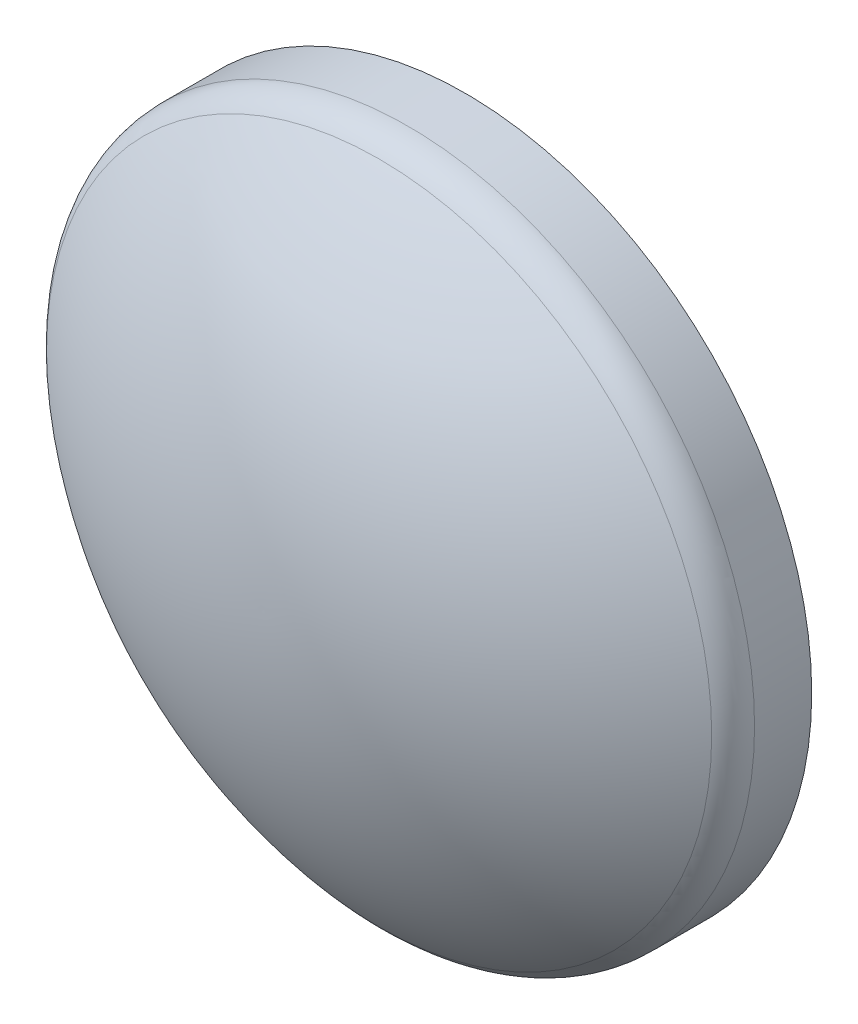
ISO-10303-21;
HEADER;
FILE_DESCRIPTION(('STEP AP214'),'2;1');
FILE_NAME('part.step','',(''),(''),'','','');
FILE_SCHEMA(('AUTOMOTIVE_DESIGN { 1 0 10303 214 1 1 1 1 }'));
ENDSEC;
DATA;
#1=APPLICATION_CONTEXT('core data for automotive mechanical design processes');
#2=APPLICATION_PROTOCOL_DEFINITION('international standard','automotive_design',2000,#1);
#3=PRODUCT_CONTEXT('',#1,'mechanical');
#4=PRODUCT('Part','Part','',(#3));
#5=PRODUCT_RELATED_PRODUCT_CATEGORY('part','',(#4));
#6=PRODUCT_DEFINITION_FORMATION('','',#4);
#7=PRODUCT_DEFINITION_CONTEXT('part definition',#1,'design');
#8=PRODUCT_DEFINITION('design','',#6,#7);
#9=PRODUCT_DEFINITION_SHAPE('','',#8);
#10=(LENGTH_UNIT() NAMED_UNIT(*) SI_UNIT(.MILLI.,.METRE.));
#11=(NAMED_UNIT(*) PLANE_ANGLE_UNIT() SI_UNIT($,.RADIAN.));
#12=(NAMED_UNIT(*) SI_UNIT($,.STERADIAN.) SOLID_ANGLE_UNIT());
#13=UNCERTAINTY_MEASURE_WITH_UNIT(LENGTH_MEASURE(1.E-05),#10,'distance_accuracy_value','');
#14=(GEOMETRIC_REPRESENTATION_CONTEXT(3) GLOBAL_UNCERTAINTY_ASSIGNED_CONTEXT((#13)) GLOBAL_UNIT_ASSIGNED_CONTEXT((#10,
#11,#12)) REPRESENTATION_CONTEXT('',''));
#15=CARTESIAN_POINT('',(0.,0.,0.));
#16=DIRECTION('',(0.,0.,1.));
#17=DIRECTION('',(1.,0.,0.));
#18=AXIS2_PLACEMENT_3D('',#15,#16,#17);
#19=CARTESIAN_POINT('',(0.,0.,12.7));
#20=DIRECTION('',(0.,0.,1.));
#21=DIRECTION('',(1.,0.,0.));
#22=AXIS2_PLACEMENT_3D('',#19,#20,#21);
#23=CYLINDRICAL_SURFACE('',#22,230.886);
#24=CARTESIAN_POINT('',(0.,0.,-12.7));
#25=DIRECTION('',(0.,0.,1.));
#26=DIRECTION('',(1.,0.,0.));
#27=AXIS2_PLACEMENT_3D('',#24,#25,#26);
#28=CIRCLE('',#27,230.886);
#29=CARTESIAN_POINT('',(230.886,0.,-12.7));
#30=VERTEX_POINT('',#29);
#31=EDGE_CURVE('E11',#30,#30,#28,.T.);
#32=ORIENTED_EDGE('',*,*,#31,.T.);
#33=EDGE_LOOP('',(#32));
#34=FACE_BOUND('',#33,.T.);
#35=CARTESIAN_POINT('',(0.,0.,25.4));
#36=DIRECTION('',(0.,0.,-1.));
#37=DIRECTION('',(-1.,0.,0.));
#38=AXIS2_PLACEMENT_3D('',#35,#36,#37);
#39=CIRCLE('',#38,230.886);
#40=CARTESIAN_POINT('',(-230.886,0.,25.4));
#41=VERTEX_POINT('',#40);
#42=EDGE_CURVE('E80',#41,#41,#39,.T.);
#43=ORIENTED_EDGE('',*,*,#42,.T.);
#44=EDGE_LOOP('',(#43));
#45=FACE_BOUND('',#44,.T.);
#46=ADVANCED_FACE('F41',(#34,#45),#23,.T.);
#47=CARTESIAN_POINT('',(1.49544603422331E-12,-215.011,-12.7));
#48=DIRECTION('',(0.,0.,1.));
#49=DIRECTION('',(1.,0.,0.));
#50=AXIS2_PLACEMENT_3D('',#47,#48,#49);
#51=PLANE('',#50);
#52=ORIENTED_EDGE('',*,*,#31,.F.);
#53=EDGE_LOOP('',(#52));
#54=FACE_BOUND('',#53,.T.);
#55=CARTESIAN_POINT('',(0.,0.,-12.7));
#56=DIRECTION('',(0.,0.,1.));
#57=DIRECTION('',(1.,0.,0.));
#58=AXIS2_PLACEMENT_3D('',#55,#56,#57);
#59=CIRCLE('',#58,215.011);
#60=CARTESIAN_POINT('',(215.011,0.,-12.7));
#61=VERTEX_POINT('',#60);
#62=EDGE_CURVE('E49',#61,#61,#59,.T.);
#63=ORIENTED_EDGE('',*,*,#62,.T.);
#64=EDGE_LOOP('',(#63));
#65=FACE_BOUND('',#64,.T.);
#66=ADVANCED_FACE('F69',(#54,#65),#51,.F.);
#67=CARTESIAN_POINT('',(0.,0.,12.7));
#68=DIRECTION('',(0.,0.,1.));
#69=DIRECTION('',(1.,0.,0.));
#70=AXIS2_PLACEMENT_3D('',#67,#68,#69);
#71=CYLINDRICAL_SURFACE('',#70,215.011);
#72=ORIENTED_EDGE('',*,*,#62,.F.);
#73=EDGE_LOOP('',(#72));
#74=FACE_BOUND('',#73,.T.);
#75=CARTESIAN_POINT('',(0.,0.,25.4));
#76=DIRECTION('',(0.,0.,1.));
#77=DIRECTION('',(1.,0.,0.));
#78=AXIS2_PLACEMENT_3D('',#75,#76,#77);
#79=CIRCLE('',#78,215.011);
#80=CARTESIAN_POINT('',(215.011,0.,25.4));
#81=VERTEX_POINT('',#80);
#82=EDGE_CURVE('E89',#81,#81,#79,.F.);
#83=ORIENTED_EDGE('',*,*,#82,.F.);
#84=EDGE_LOOP('',(#83));
#85=FACE_BOUND('',#84,.T.);
#86=ADVANCED_FACE('F74',(#74,#85),#71,.F.);
#87=CARTESIAN_POINT('',(0.,0.,25.4));
#88=DIRECTION('',(0.,0.,-1.));
#89=DIRECTION('',(-1.,0.,0.));
#90=AXIS2_PLACEMENT_3D('',#87,#88,#89);
#91=TOROIDAL_SURFACE('',#90,206.044846474665,24.8411535253345);
#92=ORIENTED_EDGE('',*,*,#42,.F.);
#93=EDGE_LOOP('',(#92));
#94=FACE_BOUND('',#93,.T.);
#95=CARTESIAN_POINT('',(0.,0.,44.732284668962));
#96=DIRECTION('',(0.,0.,-1.));
#97=DIRECTION('',(-1.,0.,0.));
#98=AXIS2_PLACEMENT_3D('',#95,#96,#97);
#99=CIRCLE('',#98,221.644387427766);
#100=CARTESIAN_POINT('',(-221.644387427766,0.,44.732284668962));
#101=VERTEX_POINT('',#100);
#102=EDGE_CURVE('E83',#101,#101,#99,.T.);
#103=ORIENTED_EDGE('',*,*,#102,.T.);
#104=EDGE_LOOP('',(#103));
#105=FACE_BOUND('',#104,.T.);
#106=ADVANCED_FACE('F100',(#94,#105),#91,.T.);
#107=CARTESIAN_POINT('',(-2.02782001108759,0.,-227.435339499214));
#108=DIRECTION('',(0.,-1.,0.));
#109=DIRECTION('',(-1.,0.,0.));
#110=AXIS2_PLACEMENT_3D('',#107,#108,#109);
#111=CIRCLE('',#110,349.72367996639);
#112=TRIMMED_CURVE('',#111,(PARAMETER_VALUE(-1.57659470846094)),
(PARAMETER_VALUE(1.57659470846094)),.T.,.PARAMETER.);
#113=CARTESIAN_POINT('',(0.,0.,-227.435339499214));
#114=DIRECTION('',(0.,0.,-1.));
#115=AXIS1_PLACEMENT('',#113,#114);
#116=SURFACE_OF_REVOLUTION('',#112,#115);
#117=ORIENTED_EDGE('',*,*,#102,.F.);
#118=EDGE_LOOP('',(#117));
#119=FACE_BOUND('',#118,.T.);
#120=CARTESIAN_POINT('',(0.,0.,122.282461413517));
#121=VERTEX_POINT('',#120);
#122=VERTEX_LOOP('',#121);
#123=FACE_BOUND('',#122,.T.);
#124=ADVANCED_FACE('F63',(#119,#123),#116,.T.);
#125=CARTESIAN_POINT('',(0.,0.,25.4));
#126=DIRECTION('',(0.,0.,-1.));
#127=DIRECTION('',(-1.,0.,0.));
#128=AXIS2_PLACEMENT_3D('',#125,#126,#127);
#129=TOROIDAL_SURFACE('',#128,206.044846474665,8.96615352533452);
#130=ORIENTED_EDGE('',*,*,#82,.T.);
#131=EDGE_LOOP('',(#130));
#132=FACE_BOUND('',#131,.T.);
#133=CARTESIAN_POINT('',(0.,0.,32.3777851564182));
#134=DIRECTION('',(0.,0.,-1.));
#135=DIRECTION('',(-1.,0.,0.));
#136=AXIS2_PLACEMENT_3D('',#133,#134,#135);
#137=CIRCLE('',#136,211.675336981783);
#138=CARTESIAN_POINT('',(-211.675336981783,0.,32.3777851564182));
#139=VERTEX_POINT('',#138);
#140=EDGE_CURVE('E92',#139,#139,#137,.T.);
#141=ORIENTED_EDGE('',*,*,#140,.F.);
#142=EDGE_LOOP('',(#141));
#143=FACE_BOUND('',#142,.T.);
#144=ADVANCED_FACE('F57',(#132,#143),#129,.F.);
#145=CARTESIAN_POINT('',(-2.02782001108759,0.,-227.435339499214));
#146=DIRECTION('',(0.,-1.,0.));
#147=DIRECTION('',(-1.,0.,0.));
#148=AXIS2_PLACEMENT_3D('',#145,#146,#147);
#149=CIRCLE('',#148,333.84867996639);
#150=TRIMMED_CURVE('',#149,(PARAMETER_VALUE(-1.5768704334251)),
(PARAMETER_VALUE(1.5768704334251)),.T.,.PARAMETER.);
#151=CARTESIAN_POINT('',(0.,0.,-227.435339499214));
#152=DIRECTION('',(0.,0.,-1.));
#153=AXIS1_PLACEMENT('',#151,#152);
#154=SURFACE_OF_REVOLUTION('',#150,#153);
#155=ORIENTED_EDGE('',*,*,#140,.T.);
#156=EDGE_LOOP('',(#155));
#157=FACE_BOUND('',#156,.T.);
#158=CARTESIAN_POINT('',(0.,0.,106.407181850754));
#159=VERTEX_POINT('',#158);
#160=VERTEX_LOOP('',#159);
#161=FACE_BOUND('',#160,.T.);
#162=ADVANCED_FACE('F55',(#157,#161),#154,.F.);
#163=CLOSED_SHELL('',(#46,#66,#86,#106,#124,#144,#162));
#164=MANIFOLD_SOLID_BREP('B2',#163);
#165=ADVANCED_BREP_SHAPE_REPRESENTATION('',(#18,#164),#14);
#166=SHAPE_DEFINITION_REPRESENTATION(#9,#165);
ENDSEC;
END-ISO-10303-21;
